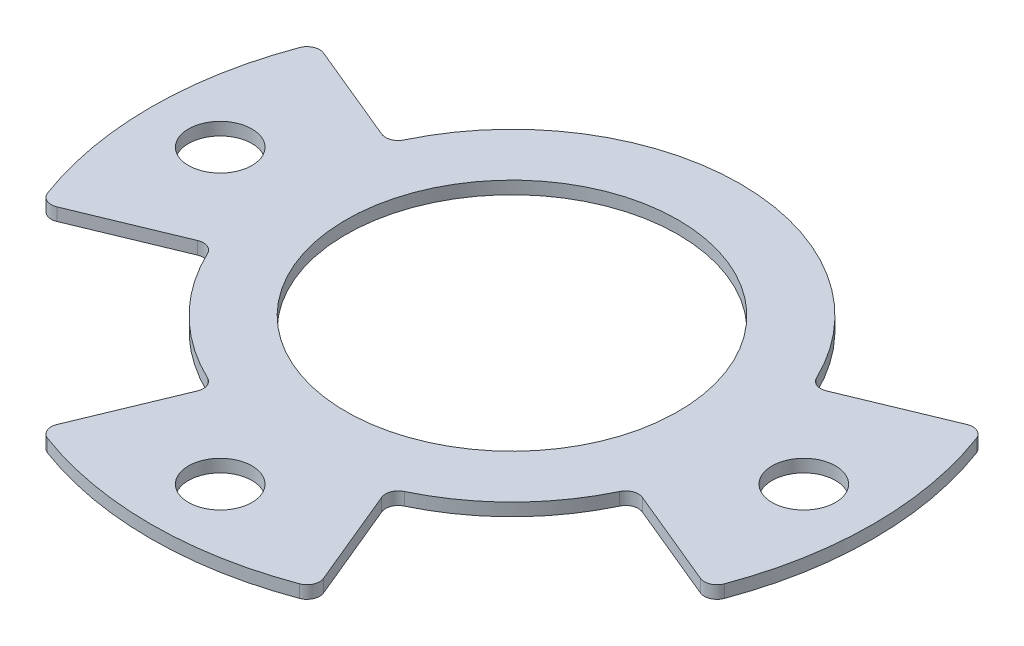
ISO-10303-21;
HEADER;
FILE_DESCRIPTION(('STEP AP214'),'2;1');
FILE_NAME('part.step','',(''),(''),'','','');
FILE_SCHEMA(('AUTOMOTIVE_DESIGN { 1 0 10303 214 1 1 1 1 }'));
ENDSEC;
DATA;
#1=APPLICATION_CONTEXT('core data for automotive mechanical design processes');
#2=APPLICATION_PROTOCOL_DEFINITION('international standard','automotive_design',2000,#1);
#3=PRODUCT_CONTEXT('',#1,'mechanical');
#4=PRODUCT('Part','Part','',(#3));
#5=PRODUCT_RELATED_PRODUCT_CATEGORY('part','',(#4));
#6=PRODUCT_DEFINITION_FORMATION('','',#4);
#7=PRODUCT_DEFINITION_CONTEXT('part definition',#1,'design');
#8=PRODUCT_DEFINITION('design','',#6,#7);
#9=PRODUCT_DEFINITION_SHAPE('','',#8);
#10=(LENGTH_UNIT() NAMED_UNIT(*) SI_UNIT(.MILLI.,.METRE.));
#11=(NAMED_UNIT(*) PLANE_ANGLE_UNIT() SI_UNIT($,.RADIAN.));
#12=(NAMED_UNIT(*) SI_UNIT($,.STERADIAN.) SOLID_ANGLE_UNIT());
#13=UNCERTAINTY_MEASURE_WITH_UNIT(LENGTH_MEASURE(1.E-05),#10,'distance_accuracy_value','');
#14=(GEOMETRIC_REPRESENTATION_CONTEXT(3) GLOBAL_UNCERTAINTY_ASSIGNED_CONTEXT((#13)) GLOBAL_UNIT_ASSIGNED_CONTEXT((#10,
#11,#12)) REPRESENTATION_CONTEXT('',''));
#15=CARTESIAN_POINT('',(0.,0.,0.));
#16=DIRECTION('',(0.,0.,1.));
#17=DIRECTION('',(1.,0.,0.));
#18=AXIS2_PLACEMENT_3D('',#15,#16,#17);
#19=CARTESIAN_POINT('',(0.,2.54,0.));
#20=DIRECTION('',(0.,-1.,0.));
#21=DIRECTION('',(0.,0.,-1.));
#22=AXIS2_PLACEMENT_3D('',#19,#20,#21);
#23=CYLINDRICAL_SURFACE('',#22,72.3);
#24=CARTESIAN_POINT('',(0.,0.,0.));
#25=DIRECTION('',(0.,1.,0.));
#26=DIRECTION('',(0.,0.,1.));
#27=AXIS2_PLACEMENT_3D('',#24,#25,#26);
#28=CIRCLE('',#27,72.3);
#29=CARTESIAN_POINT('',(-25.2175689687756,0.,67.7596060740102));
#30=VERTEX_POINT('',#29);
#31=CARTESIAN_POINT('',(25.2175689687756,0.,67.7596060740102));
#32=VERTEX_POINT('',#31);
#33=EDGE_CURVE('E223',#30,#32,#28,.T.);
#34=ORIENTED_EDGE('',*,*,#33,.T.);
#35=DIRECTION('',(0.,-1.,0.));
#36=VECTOR('',#35,1.);
#37=CARTESIAN_POINT('',(25.2175689687756,2.54,67.7596060740103));
#38=LINE('',#37,#36);
#39=CARTESIAN_POINT('',(25.2175689687756,2.54,67.7596060740102));
#40=VERTEX_POINT('',#39);
#41=EDGE_CURVE('E311',#32,#40,#38,.F.);
#42=ORIENTED_EDGE('',*,*,#41,.T.);
#43=CARTESIAN_POINT('',(0.,2.54,0.));
#44=DIRECTION('',(0.,1.,0.));
#45=DIRECTION('',(0.,0.,1.));
#46=AXIS2_PLACEMENT_3D('',#43,#44,#45);
#47=CIRCLE('',#46,72.3);
#48=CARTESIAN_POINT('',(-25.2175689687756,2.54,67.7596060740102));
#49=VERTEX_POINT('',#48);
#50=EDGE_CURVE('E227',#49,#40,#47,.T.);
#51=ORIENTED_EDGE('',*,*,#50,.F.);
#52=DIRECTION('',(0.,-1.,0.));
#53=VECTOR('',#52,1.);
#54=CARTESIAN_POINT('',(-25.2175689687756,2.54,67.7596060740103));
#55=LINE('',#54,#53);
#56=EDGE_CURVE('E308',#49,#30,#55,.T.);
#57=ORIENTED_EDGE('',*,*,#56,.T.);
#58=EDGE_LOOP('',(#34,#42,#51,#57));
#59=FACE_BOUND('',#58,.T.);
#60=ADVANCED_FACE('F31',(#59),#23,.T.);
#61=CARTESIAN_POINT('',(-67.7596060740103,2.54,-25.2175689687756));
#62=VERTEX_POINT('',#61);
#63=CARTESIAN_POINT('',(-67.7596060740102,2.54,25.2175689687759));
#64=VERTEX_POINT('',#63);
#65=EDGE_CURVE('E215',#62,#64,#47,.T.);
#66=ORIENTED_EDGE('',*,*,#65,.F.);
#67=DIRECTION('',(0.,-1.,0.));
#68=VECTOR('',#67,1.);
#69=CARTESIAN_POINT('',(-67.7596060740103,2.54,-25.2175689687756));
#70=LINE('',#69,#68);
#71=CARTESIAN_POINT('',(-67.7596060740103,0.,-25.2175689687756));
#72=VERTEX_POINT('',#71);
#73=EDGE_CURVE('E198',#62,#72,#70,.T.);
#74=ORIENTED_EDGE('',*,*,#73,.T.);
#75=CARTESIAN_POINT('',(-67.7596060740102,0.,25.2175689687759));
#76=VERTEX_POINT('',#75);
#77=EDGE_CURVE('E212',#72,#76,#28,.T.);
#78=ORIENTED_EDGE('',*,*,#77,.T.);
#79=DIRECTION('',(0.,-1.,0.));
#80=VECTOR('',#79,1.);
#81=CARTESIAN_POINT('',(-67.7596060740102,2.54,25.2175689687759));
#82=LINE('',#81,#80);
#83=EDGE_CURVE('E217',#76,#64,#82,.F.);
#84=ORIENTED_EDGE('',*,*,#83,.T.);
#85=EDGE_LOOP('',(#66,#74,#78,#84));
#86=FACE_BOUND('',#85,.T.);
#87=ADVANCED_FACE('F210',(#86),#23,.T.);
#88=CARTESIAN_POINT('',(67.7596060740102,0.,25.2175689687759));
#89=VERTEX_POINT('',#88);
#90=CARTESIAN_POINT('',(67.7596060740102,0.,-25.2175689687756));
#91=VERTEX_POINT('',#90);
#92=EDGE_CURVE('E225',#89,#91,#28,.T.);
#93=ORIENTED_EDGE('',*,*,#92,.T.);
#94=DIRECTION('',(0.,-1.,0.));
#95=VECTOR('',#94,1.);
#96=CARTESIAN_POINT('',(67.7596060740102,2.54,-25.2175689687756));
#97=LINE('',#96,#95);
#98=CARTESIAN_POINT('',(67.7596060740102,2.54,-25.2175689687756));
#99=VERTEX_POINT('',#98);
#100=EDGE_CURVE('E292',#91,#99,#97,.F.);
#101=ORIENTED_EDGE('',*,*,#100,.T.);
#102=CARTESIAN_POINT('',(67.7596060740102,2.54,25.2175689687759));
#103=VERTEX_POINT('',#102);
#104=EDGE_CURVE('E222',#103,#99,#47,.T.);
#105=ORIENTED_EDGE('',*,*,#104,.F.);
#106=DIRECTION('',(0.,-1.,0.));
#107=VECTOR('',#106,1.);
#108=CARTESIAN_POINT('',(67.7596060740102,2.54,25.2175689687759));
#109=LINE('',#108,#107);
#110=EDGE_CURVE('E290',#103,#89,#109,.T.);
#111=ORIENTED_EDGE('',*,*,#110,.T.);
#112=EDGE_LOOP('',(#93,#101,#105,#111));
#113=FACE_BOUND('',#112,.T.);
#114=ADVANCED_FACE('F436',(#113),#23,.T.);
#115=CARTESIAN_POINT('',(0.,2.54,0.));
#116=DIRECTION('',(0.,1.,0.));
#117=DIRECTION('',(0.,0.,1.));
#118=AXIS2_PLACEMENT_3D('',#115,#116,#117);
#119=PLANE('',#118);
#120=DIRECTION('',(-0.923879532511287,0.,-0.38268343236509));
#121=VECTOR('',#120,1.);
#122=CARTESIAN_POINT('',(-42.239772226416,2.54,-17.4962865277319));
#123=LINE('',#122,#121);
#124=CARTESIAN_POINT('',(-44.524629360732,2.54,-18.4427053408505));
#125=VERTEX_POINT('',#124);
#126=CARTESIAN_POINT('',(-64.4071005371586,2.54,-26.6782945556186));
#127=VERTEX_POINT('',#126);
#128=EDGE_CURVE('E388',#125,#127,#123,.T.);
#129=ORIENTED_EDGE('',*,*,#128,.T.);
#130=CARTESIAN_POINT('',(-65.3791164553659,2.54,-24.3316405430399));
#131=DIRECTION('',(0.,1.,0.));
#132=DIRECTION('',(0.,0.,1.));
#133=AXIS2_PLACEMENT_3D('',#130,#131,#132);
#134=CIRCLE('',#133,2.54);
#135=EDGE_CURVE('E279',#127,#62,#134,.T.);
#136=ORIENTED_EDGE('',*,*,#135,.T.);
#137=ORIENTED_EDGE('',*,*,#65,.T.);
#138=CARTESIAN_POINT('',(-65.3791164553658,2.54,24.3316405430402));
#139=DIRECTION('',(0.,1.,0.));
#140=DIRECTION('',(0.,0.,1.));
#141=AXIS2_PLACEMENT_3D('',#138,#139,#140);
#142=CIRCLE('',#141,2.54);
#143=CARTESIAN_POINT('',(-64.4071005371585,2.54,26.6782945556188));
#144=VERTEX_POINT('',#143);
#145=EDGE_CURVE('E271',#64,#144,#142,.T.);
#146=ORIENTED_EDGE('',*,*,#145,.T.);
#147=DIRECTION('',(0.923879532511285,0.,-0.382683432365094));
#148=VECTOR('',#147,1.);
#149=CARTESIAN_POINT('',(-42.239772226416,2.54,17.4962865277321));
#150=LINE('',#149,#148);
#151=CARTESIAN_POINT('',(-44.524629360732,2.54,18.4427053408507));
#152=VERTEX_POINT('',#151);
#153=EDGE_CURVE('E367',#144,#152,#150,.T.);
#154=ORIENTED_EDGE('',*,*,#153,.T.);
#155=CARTESIAN_POINT('',(-43.5526134425246,2.54,20.7893593534294));
#156=DIRECTION('',(0.,1.,0.));
#157=DIRECTION('',(0.,0.,1.));
#158=AXIS2_PLACEMENT_3D('',#155,#156,#157);
#159=CIRCLE('',#158,2.54);
#160=CARTESIAN_POINT('',(-41.2603706297602,2.54,19.6951825453542));
#161=VERTEX_POINT('',#160);
#162=EDGE_CURVE('E11',#152,#161,#159,.F.);
#163=ORIENTED_EDGE('',*,*,#162,.T.);
#164=CARTESIAN_POINT('',(0.,2.54,0.));
#165=DIRECTION('',(0.,1.,0.));
#166=DIRECTION('',(0.,0.,-1.));
#167=AXIS2_PLACEMENT_3D('',#164,#165,#166);
#168=CIRCLE('',#167,45.72);
#169=CARTESIAN_POINT('',(-19.695182545354,2.54,41.2603706297602));
#170=VERTEX_POINT('',#169);
#171=EDGE_CURVE('E365',#161,#170,#168,.T.);
#172=ORIENTED_EDGE('',*,*,#171,.T.);
#173=CARTESIAN_POINT('',(-20.7893593534292,2.54,43.5526134425247));
#174=DIRECTION('',(0.,1.,0.));
#175=DIRECTION('',(0.,0.,1.));
#176=AXIS2_PLACEMENT_3D('',#173,#174,#175);
#177=CIRCLE('',#176,2.54);
#178=CARTESIAN_POINT('',(-18.4427053408506,2.54,44.524629360732));
#179=VERTEX_POINT('',#178);
#180=EDGE_CURVE('E345',#170,#179,#177,.F.);
#181=ORIENTED_EDGE('',*,*,#180,.T.);
#182=DIRECTION('',(-0.38268343236509,0.,0.923879532511287));
#183=VECTOR('',#182,1.);
#184=CARTESIAN_POINT('',(-35.0924833906736,2.54,84.7207493391165));
#185=LINE('',#184,#183);
#186=CARTESIAN_POINT('',(-26.6782945556186,2.54,64.4071005371586));
#187=VERTEX_POINT('',#186);
#188=EDGE_CURVE('E371',#179,#187,#185,.T.);
#189=ORIENTED_EDGE('',*,*,#188,.T.);
#190=CARTESIAN_POINT('',(-24.3316405430399,2.54,65.3791164553659));
#191=DIRECTION('',(0.,1.,0.));
#192=DIRECTION('',(0.,0.,1.));
#193=AXIS2_PLACEMENT_3D('',#190,#191,#192);
#194=CIRCLE('',#193,2.54);
#195=EDGE_CURVE('E54',#187,#49,#194,.T.);
#196=ORIENTED_EDGE('',*,*,#195,.T.);
#197=ORIENTED_EDGE('',*,*,#50,.T.);
#198=CARTESIAN_POINT('',(24.3316405430399,2.54,65.3791164553659));
#199=DIRECTION('',(0.,1.,0.));
#200=DIRECTION('',(0.,0.,1.));
#201=AXIS2_PLACEMENT_3D('',#198,#199,#200);
#202=CIRCLE('',#201,2.54);
#203=CARTESIAN_POINT('',(26.6782945556186,2.54,64.4071005371586));
#204=VERTEX_POINT('',#203);
#205=EDGE_CURVE('E46',#40,#204,#202,.T.);
#206=ORIENTED_EDGE('',*,*,#205,.T.);
#207=DIRECTION('',(-0.38268343236509,0.,-0.923879532511287));
#208=VECTOR('',#207,1.);
#209=CARTESIAN_POINT('',(35.0924833906736,2.54,84.7207493391165));
#210=LINE('',#209,#208);
#211=CARTESIAN_POINT('',(18.4427053408506,2.54,44.524629360732));
#212=VERTEX_POINT('',#211);
#213=EDGE_CURVE('E383',#204,#212,#210,.T.);
#214=ORIENTED_EDGE('',*,*,#213,.T.);
#215=CARTESIAN_POINT('',(20.7893593534292,2.54,43.5526134425247));
#216=DIRECTION('',(0.,1.,0.));
#217=DIRECTION('',(0.,0.,1.));
#218=AXIS2_PLACEMENT_3D('',#215,#216,#217);
#219=CIRCLE('',#218,2.54);
#220=CARTESIAN_POINT('',(19.695182545354,2.54,41.2603706297602));
#221=VERTEX_POINT('',#220);
#222=EDGE_CURVE('E341',#212,#221,#219,.F.);
#223=ORIENTED_EDGE('',*,*,#222,.T.);
#224=CARTESIAN_POINT('',(0.,2.54,0.));
#225=DIRECTION('',(0.,1.,0.));
#226=DIRECTION('',(0.,0.,1.));
#227=AXIS2_PLACEMENT_3D('',#224,#225,#226);
#228=CIRCLE('',#227,45.72);
#229=CARTESIAN_POINT('',(41.2603706297602,2.54,19.6951825453542));
#230=VERTEX_POINT('',#229);
#231=EDGE_CURVE('E671',#221,#230,#228,.T.);
#232=ORIENTED_EDGE('',*,*,#231,.T.);
#233=CARTESIAN_POINT('',(43.5526134425246,2.54,20.7893593534294));
#234=DIRECTION('',(0.,1.,0.));
#235=DIRECTION('',(0.,0.,1.));
#236=AXIS2_PLACEMENT_3D('',#233,#234,#235);
#237=CIRCLE('',#236,2.54);
#238=CARTESIAN_POINT('',(44.524629360732,2.54,18.4427053408507));
#239=VERTEX_POINT('',#238);
#240=EDGE_CURVE('E337',#230,#239,#237,.F.);
#241=ORIENTED_EDGE('',*,*,#240,.T.);
#242=DIRECTION('',(0.923879532511285,0.,0.382683432365094));
#243=VECTOR('',#242,1.);
#244=CARTESIAN_POINT('',(42.239772226416,2.54,17.4962865277321));
#245=LINE('',#244,#243);
#246=CARTESIAN_POINT('',(64.4071005371585,2.54,26.6782945556188));
#247=VERTEX_POINT('',#246);
#248=EDGE_CURVE('E668',#239,#247,#245,.T.);
#249=ORIENTED_EDGE('',*,*,#248,.T.);
#250=CARTESIAN_POINT('',(65.3791164553658,2.54,24.3316405430402));
#251=DIRECTION('',(0.,1.,0.));
#252=DIRECTION('',(0.,0.,1.));
#253=AXIS2_PLACEMENT_3D('',#250,#251,#252);
#254=CIRCLE('',#253,2.54);
#255=EDGE_CURVE('E275',#247,#103,#254,.T.);
#256=ORIENTED_EDGE('',*,*,#255,.T.);
#257=ORIENTED_EDGE('',*,*,#104,.T.);
#258=CARTESIAN_POINT('',(65.3791164553659,2.54,-24.3316405430399));
#259=DIRECTION('',(0.,1.,0.));
#260=DIRECTION('',(0.,0.,1.));
#261=AXIS2_PLACEMENT_3D('',#258,#259,#260);
#262=CIRCLE('',#261,2.54);
#263=CARTESIAN_POINT('',(64.4071005371586,2.54,-26.6782945556186));
#264=VERTEX_POINT('',#263);
#265=EDGE_CURVE('E277',#99,#264,#262,.T.);
#266=ORIENTED_EDGE('',*,*,#265,.T.);
#267=DIRECTION('',(-0.923879532511286,0.,0.382683432365091));
#268=VECTOR('',#267,1.);
#269=CARTESIAN_POINT('',(196.027114775618,2.54,-81.1970895329286));
#270=LINE('',#269,#268);
#271=CARTESIAN_POINT('',(44.524629360732,2.54,-18.4427053408506));
#272=VERTEX_POINT('',#271);
#273=EDGE_CURVE('E391',#264,#272,#270,.T.);
#274=ORIENTED_EDGE('',*,*,#273,.T.);
#275=CARTESIAN_POINT('',(43.5526134425247,2.54,-20.7893593534292));
#276=DIRECTION('',(0.,1.,0.));
#277=DIRECTION('',(0.,0.,1.));
#278=AXIS2_PLACEMENT_3D('',#275,#276,#277);
#279=CIRCLE('',#278,2.54);
#280=CARTESIAN_POINT('',(41.2603706297602,2.54,-19.695182545354));
#281=VERTEX_POINT('',#280);
#282=EDGE_CURVE('E333',#272,#281,#279,.F.);
#283=ORIENTED_EDGE('',*,*,#282,.T.);
#284=CARTESIAN_POINT('',(0.,2.54,0.));
#285=DIRECTION('',(0.,1.,0.));
#286=DIRECTION('',(0.,0.,-1.));
#287=AXIS2_PLACEMENT_3D('',#284,#285,#286);
#288=CIRCLE('',#287,45.72);
#289=CARTESIAN_POINT('',(-41.2603706297603,2.54,-19.695182545354));
#290=VERTEX_POINT('',#289);
#291=EDGE_CURVE('E385',#281,#290,#288,.T.);
#292=ORIENTED_EDGE('',*,*,#291,.T.);
#293=CARTESIAN_POINT('',(-43.5526134425247,2.54,-20.7893593534292));
#294=DIRECTION('',(0.,1.,0.));
#295=DIRECTION('',(0.,0.,1.));
#296=AXIS2_PLACEMENT_3D('',#293,#294,#295);
#297=CIRCLE('',#296,2.54);
#298=EDGE_CURVE('E329',#290,#125,#297,.F.);
#299=ORIENTED_EDGE('',*,*,#298,.T.);
#300=EDGE_LOOP('',(#129,#136,#137,#146,#154,#163,#172,#181,#189,#196,#197,#206,#214,#223,#232,
#241,#249,#256,#257,#266,#274,#283,#292,#299));
#301=FACE_BOUND('',#300,.T.);
#302=CARTESIAN_POINT('',(0.,2.54,0.));
#303=DIRECTION('',(0.,-1.,0.));
#304=DIRECTION('',(0.,0.,-1.));
#305=AXIS2_PLACEMENT_3D('',#302,#303,#304);
#306=CIRCLE('',#305,33.25);
#307=CARTESIAN_POINT('',(0.,2.54,-33.25));
#308=VERTEX_POINT('',#307);
#309=EDGE_CURVE('E398',#308,#308,#306,.T.);
#310=ORIENTED_EDGE('',*,*,#309,.T.);
#311=EDGE_LOOP('',(#310));
#312=FACE_BOUND('',#311,.T.);
#313=CARTESIAN_POINT('',(0.,2.54,58.42));
#314=DIRECTION('',(0.,-1.,0.));
#315=DIRECTION('',(0.,0.,-1.));
#316=AXIS2_PLACEMENT_3D('',#313,#314,#315);
#317=CIRCLE('',#316,6.35);
#318=CARTESIAN_POINT('',(0.,2.54,52.07));
#319=VERTEX_POINT('',#318);
#320=EDGE_CURVE('E404',#319,#319,#317,.T.);
#321=ORIENTED_EDGE('',*,*,#320,.T.);
#322=EDGE_LOOP('',(#321));
#323=FACE_BOUND('',#322,.T.);
#324=CARTESIAN_POINT('',(58.42,2.54,0.));
#325=DIRECTION('',(0.,-1.,0.));
#326=DIRECTION('',(0.,0.,1.));
#327=AXIS2_PLACEMENT_3D('',#324,#325,#326);
#328=CIRCLE('',#327,6.35);
#329=CARTESIAN_POINT('',(58.42,2.54,6.35));
#330=VERTEX_POINT('',#329);
#331=EDGE_CURVE('E244',#330,#330,#328,.T.);
#332=ORIENTED_EDGE('',*,*,#331,.T.);
#333=EDGE_LOOP('',(#332));
#334=FACE_BOUND('',#333,.T.);
#335=CARTESIAN_POINT('',(-58.42,2.54,0.));
#336=DIRECTION('',(0.,-1.,0.));
#337=DIRECTION('',(0.,0.,-1.));
#338=AXIS2_PLACEMENT_3D('',#335,#336,#337);
#339=CIRCLE('',#338,6.35);
#340=CARTESIAN_POINT('',(-58.42,2.54,-6.35));
#341=VERTEX_POINT('',#340);
#342=EDGE_CURVE('E232',#341,#341,#339,.T.);
#343=ORIENTED_EDGE('',*,*,#342,.T.);
#344=EDGE_LOOP('',(#343));
#345=FACE_BOUND('',#344,.T.);
#346=ADVANCED_FACE('F363',(#301,#312,#323,#334,#345),#119,.T.);
#347=CARTESIAN_POINT('',(0.,0.,0.));
#348=DIRECTION('',(0.,1.,0.));
#349=DIRECTION('',(0.,0.,1.));
#350=AXIS2_PLACEMENT_3D('',#347,#348,#349);
#351=PLANE('',#350);
#352=CARTESIAN_POINT('',(0.,0.,0.));
#353=DIRECTION('',(0.,-1.,0.));
#354=DIRECTION('',(0.,0.,-1.));
#355=AXIS2_PLACEMENT_3D('',#352,#353,#354);
#356=CIRCLE('',#355,33.25);
#357=CARTESIAN_POINT('',(0.,0.,-33.25));
#358=VERTEX_POINT('',#357);
#359=EDGE_CURVE('E394',#358,#358,#356,.T.);
#360=ORIENTED_EDGE('',*,*,#359,.F.);
#361=EDGE_LOOP('',(#360));
#362=FACE_BOUND('',#361,.T.);
#363=CARTESIAN_POINT('',(0.,0.,58.42));
#364=DIRECTION('',(0.,-1.,0.));
#365=DIRECTION('',(0.,0.,-1.));
#366=AXIS2_PLACEMENT_3D('',#363,#364,#365);
#367=CIRCLE('',#366,6.35);
#368=CARTESIAN_POINT('',(0.,0.,52.07));
#369=VERTEX_POINT('',#368);
#370=EDGE_CURVE('E401',#369,#369,#367,.T.);
#371=ORIENTED_EDGE('',*,*,#370,.F.);
#372=EDGE_LOOP('',(#371));
#373=FACE_BOUND('',#372,.T.);
#374=CARTESIAN_POINT('',(58.42,0.,0.));
#375=DIRECTION('',(0.,-1.,0.));
#376=DIRECTION('',(0.,0.,1.));
#377=AXIS2_PLACEMENT_3D('',#374,#375,#376);
#378=CIRCLE('',#377,6.35);
#379=CARTESIAN_POINT('',(58.42,0.,6.35));
#380=VERTEX_POINT('',#379);
#381=EDGE_CURVE('E247',#380,#380,#378,.T.);
#382=ORIENTED_EDGE('',*,*,#381,.F.);
#383=EDGE_LOOP('',(#382));
#384=FACE_BOUND('',#383,.T.);
#385=CARTESIAN_POINT('',(-58.42,0.,0.));
#386=DIRECTION('',(0.,-1.,0.));
#387=DIRECTION('',(0.,0.,-1.));
#388=AXIS2_PLACEMENT_3D('',#385,#386,#387);
#389=CIRCLE('',#388,6.35);
#390=CARTESIAN_POINT('',(-58.42,0.,-6.35));
#391=VERTEX_POINT('',#390);
#392=EDGE_CURVE('E239',#391,#391,#389,.T.);
#393=ORIENTED_EDGE('',*,*,#392,.F.);
#394=EDGE_LOOP('',(#393));
#395=FACE_BOUND('',#394,.T.);
#396=ORIENTED_EDGE('',*,*,#77,.F.);
#397=CARTESIAN_POINT('',(-65.3791164553659,0.,-24.3316405430399));
#398=DIRECTION('',(0.,1.,0.));
#399=DIRECTION('',(0.,0.,1.));
#400=AXIS2_PLACEMENT_3D('',#397,#398,#399);
#401=CIRCLE('',#400,2.54);
#402=CARTESIAN_POINT('',(-64.4071005371586,0.,-26.6782945556186));
#403=VERTEX_POINT('',#402);
#404=EDGE_CURVE('E194',#72,#403,#401,.F.);
#405=ORIENTED_EDGE('',*,*,#404,.T.);
#406=DIRECTION('',(-0.923879532511287,0.,-0.38268343236509));
#407=VECTOR('',#406,1.);
#408=CARTESIAN_POINT('',(-42.239772226416,0.,-17.4962865277319));
#409=LINE('',#408,#407);
#410=CARTESIAN_POINT('',(-44.524629360732,0.,-18.4427053408505));
#411=VERTEX_POINT('',#410);
#412=EDGE_CURVE('E389',#411,#403,#409,.T.);
#413=ORIENTED_EDGE('',*,*,#412,.F.);
#414=CARTESIAN_POINT('',(-43.5526134425247,0.,-20.7893593534292));
#415=DIRECTION('',(0.,1.,0.));
#416=DIRECTION('',(0.,0.,1.));
#417=AXIS2_PLACEMENT_3D('',#414,#415,#416);
#418=CIRCLE('',#417,2.54);
#419=CARTESIAN_POINT('',(-41.2603706297603,0.,-19.695182545354));
#420=VERTEX_POINT('',#419);
#421=EDGE_CURVE('E327',#411,#420,#418,.T.);
#422=ORIENTED_EDGE('',*,*,#421,.T.);
#423=CARTESIAN_POINT('',(0.,0.,0.));
#424=DIRECTION('',(0.,1.,0.));
#425=DIRECTION('',(0.,0.,-1.));
#426=AXIS2_PLACEMENT_3D('',#423,#424,#425);
#427=CIRCLE('',#426,45.72);
#428=CARTESIAN_POINT('',(41.2603706297602,0.,-19.695182545354));
#429=VERTEX_POINT('',#428);
#430=EDGE_CURVE('E382',#429,#420,#427,.T.);
#431=ORIENTED_EDGE('',*,*,#430,.F.);
#432=CARTESIAN_POINT('',(43.5526134425247,0.,-20.7893593534292));
#433=DIRECTION('',(0.,1.,0.));
#434=DIRECTION('',(0.,0.,1.));
#435=AXIS2_PLACEMENT_3D('',#432,#433,#434);
#436=CIRCLE('',#435,2.54);
#437=CARTESIAN_POINT('',(44.5246293607321,0.,-18.4427053408506));
#438=VERTEX_POINT('',#437);
#439=EDGE_CURVE('E331',#429,#438,#436,.T.);
#440=ORIENTED_EDGE('',*,*,#439,.T.);
#441=DIRECTION('',(0.923879532511287,0.,-0.382683432365091));
#442=VECTOR('',#441,1.);
#443=CARTESIAN_POINT('',(0.,0.,0.));
#444=LINE('',#443,#442);
#445=CARTESIAN_POINT('',(64.4071005371586,0.,-26.6782945556186));
#446=VERTEX_POINT('',#445);
#447=EDGE_CURVE('E249',#438,#446,#444,.T.);
#448=ORIENTED_EDGE('',*,*,#447,.T.);
#449=CARTESIAN_POINT('',(65.3791164553659,0.,-24.3316405430399));
#450=DIRECTION('',(0.,1.,0.));
#451=DIRECTION('',(0.,0.,1.));
#452=AXIS2_PLACEMENT_3D('',#449,#450,#451);
#453=CIRCLE('',#452,2.54);
#454=EDGE_CURVE('E205',#446,#91,#453,.F.);
#455=ORIENTED_EDGE('',*,*,#454,.T.);
#456=ORIENTED_EDGE('',*,*,#92,.F.);
#457=CARTESIAN_POINT('',(65.3791164553658,0.,24.3316405430402));
#458=DIRECTION('',(0.,1.,0.));
#459=DIRECTION('',(0.,0.,1.));
#460=AXIS2_PLACEMENT_3D('',#457,#458,#459);
#461=CIRCLE('',#460,2.54);
#462=CARTESIAN_POINT('',(64.4071005371585,0.,26.6782945556188));
#463=VERTEX_POINT('',#462);
#464=EDGE_CURVE('E265',#89,#463,#461,.F.);
#465=ORIENTED_EDGE('',*,*,#464,.T.);
#466=DIRECTION('',(0.923879532511285,0.,0.382683432365094));
#467=VECTOR('',#466,1.);
#468=CARTESIAN_POINT('',(42.239772226416,0.,17.4962865277321));
#469=LINE('',#468,#467);
#470=CARTESIAN_POINT('',(44.524629360732,0.,18.4427053408507));
#471=VERTEX_POINT('',#470);
#472=EDGE_CURVE('E378',#471,#463,#469,.T.);
#473=ORIENTED_EDGE('',*,*,#472,.F.);
#474=CARTESIAN_POINT('',(43.5526134425246,0.,20.7893593534294));
#475=DIRECTION('',(0.,1.,0.));
#476=DIRECTION('',(0.,0.,1.));
#477=AXIS2_PLACEMENT_3D('',#474,#475,#476);
#478=CIRCLE('',#477,2.54);
#479=CARTESIAN_POINT('',(41.2603706297602,0.,19.6951825453542));
#480=VERTEX_POINT('',#479);
#481=EDGE_CURVE('E335',#471,#480,#478,.T.);
#482=ORIENTED_EDGE('',*,*,#481,.T.);
#483=CARTESIAN_POINT('',(0.,0.,0.));
#484=DIRECTION('',(0.,1.,0.));
#485=DIRECTION('',(0.,0.,1.));
#486=AXIS2_PLACEMENT_3D('',#483,#484,#485);
#487=CIRCLE('',#486,45.72);
#488=CARTESIAN_POINT('',(19.695182545354,0.,41.2603706297602));
#489=VERTEX_POINT('',#488);
#490=EDGE_CURVE('E674',#489,#480,#487,.T.);
#491=ORIENTED_EDGE('',*,*,#490,.F.);
#492=CARTESIAN_POINT('',(20.7893593534292,0.,43.5526134425247));
#493=DIRECTION('',(0.,1.,0.));
#494=DIRECTION('',(0.,0.,1.));
#495=AXIS2_PLACEMENT_3D('',#492,#493,#494);
#496=CIRCLE('',#495,2.54);
#497=CARTESIAN_POINT('',(18.4427053408506,0.,44.524629360732));
#498=VERTEX_POINT('',#497);
#499=EDGE_CURVE('E339',#489,#498,#496,.T.);
#500=ORIENTED_EDGE('',*,*,#499,.T.);
#501=DIRECTION('',(0.38268343236509,0.,0.923879532511287));
#502=VECTOR('',#501,1.);
#503=CARTESIAN_POINT('',(0.,0.,0.));
#504=LINE('',#503,#502);
#505=CARTESIAN_POINT('',(26.6782945556186,0.,64.4071005371586));
#506=VERTEX_POINT('',#505);
#507=EDGE_CURVE('E254',#498,#506,#504,.T.);
#508=ORIENTED_EDGE('',*,*,#507,.T.);
#509=CARTESIAN_POINT('',(24.3316405430399,0.,65.3791164553659));
#510=DIRECTION('',(0.,1.,0.));
#511=DIRECTION('',(0.,0.,1.));
#512=AXIS2_PLACEMENT_3D('',#509,#510,#511);
#513=CIRCLE('',#512,2.54);
#514=EDGE_CURVE('E263',#506,#32,#513,.F.);
#515=ORIENTED_EDGE('',*,*,#514,.T.);
#516=ORIENTED_EDGE('',*,*,#33,.F.);
#517=CARTESIAN_POINT('',(-24.3316405430399,0.,65.3791164553659));
#518=DIRECTION('',(0.,1.,0.));
#519=DIRECTION('',(0.,0.,1.));
#520=AXIS2_PLACEMENT_3D('',#517,#518,#519);
#521=CIRCLE('',#520,2.54);
#522=CARTESIAN_POINT('',(-26.6782945556186,0.,64.4071005371586));
#523=VERTEX_POINT('',#522);
#524=EDGE_CURVE('E261',#30,#523,#521,.F.);
#525=ORIENTED_EDGE('',*,*,#524,.T.);
#526=DIRECTION('',(-0.38268343236509,0.,0.923879532511287));
#527=VECTOR('',#526,1.);
#528=CARTESIAN_POINT('',(-35.0924833906736,0.,84.7207493391165));
#529=LINE('',#528,#527);
#530=CARTESIAN_POINT('',(-18.4427053408506,0.,44.524629360732));
#531=VERTEX_POINT('',#530);
#532=EDGE_CURVE('E372',#531,#523,#529,.T.);
#533=ORIENTED_EDGE('',*,*,#532,.F.);
#534=CARTESIAN_POINT('',(-20.7893593534292,0.,43.5526134425247));
#535=DIRECTION('',(0.,1.,0.));
#536=DIRECTION('',(0.,0.,1.));
#537=AXIS2_PLACEMENT_3D('',#534,#535,#536);
#538=CIRCLE('',#537,2.54);
#539=CARTESIAN_POINT('',(-19.695182545354,0.,41.2603706297602));
#540=VERTEX_POINT('',#539);
#541=EDGE_CURVE('E343',#531,#540,#538,.T.);
#542=ORIENTED_EDGE('',*,*,#541,.T.);
#543=CARTESIAN_POINT('',(0.,0.,0.));
#544=DIRECTION('',(0.,1.,0.));
#545=DIRECTION('',(0.,0.,-1.));
#546=AXIS2_PLACEMENT_3D('',#543,#544,#545);
#547=CIRCLE('',#546,45.72);
#548=CARTESIAN_POINT('',(-41.2603706297602,0.,19.6951825453542));
#549=VERTEX_POINT('',#548);
#550=EDGE_CURVE('E349',#549,#540,#547,.T.);
#551=ORIENTED_EDGE('',*,*,#550,.F.);
#552=CARTESIAN_POINT('',(-43.5526134425246,0.,20.7893593534294));
#553=DIRECTION('',(0.,1.,0.));
#554=DIRECTION('',(0.,0.,1.));
#555=AXIS2_PLACEMENT_3D('',#552,#553,#554);
#556=CIRCLE('',#555,2.54);
#557=CARTESIAN_POINT('',(-44.524629360732,0.,18.4427053408507));
#558=VERTEX_POINT('',#557);
#559=EDGE_CURVE('E39',#549,#558,#556,.T.);
#560=ORIENTED_EDGE('',*,*,#559,.T.);
#561=DIRECTION('',(-0.923879532511285,0.,0.382683432365094));
#562=VECTOR('',#561,1.);
#563=CARTESIAN_POINT('',(0.,0.,0.));
#564=LINE('',#563,#562);
#565=CARTESIAN_POINT('',(-64.4071005371585,0.,26.6782945556188));
#566=VERTEX_POINT('',#565);
#567=EDGE_CURVE('E251',#558,#566,#564,.T.);
#568=ORIENTED_EDGE('',*,*,#567,.T.);
#569=CARTESIAN_POINT('',(-65.3791164553658,0.,24.3316405430402));
#570=DIRECTION('',(0.,1.,0.));
#571=DIRECTION('',(0.,0.,1.));
#572=AXIS2_PLACEMENT_3D('',#569,#570,#571);
#573=CIRCLE('',#572,2.54);
#574=EDGE_CURVE('E216',#566,#76,#573,.F.);
#575=ORIENTED_EDGE('',*,*,#574,.T.);
#576=EDGE_LOOP('',(#396,#405,#413,#422,#431,#440,#448,#455,#456,#465,#473,#482,#491,#500,#508,
#515,#516,#525,#533,#542,#551,#560,#568,#575));
#577=FACE_BOUND('',#576,.T.);
#578=ADVANCED_FACE('F219',(#362,#373,#384,#395,#577),#351,.F.);
#579=CARTESIAN_POINT('',(-58.42,2.54,0.));
#580=DIRECTION('',(0.,-1.,0.));
#581=DIRECTION('',(0.,0.,-1.));
#582=AXIS2_PLACEMENT_3D('',#579,#580,#581);
#583=CYLINDRICAL_SURFACE('',#582,6.35);
#584=ORIENTED_EDGE('',*,*,#342,.F.);
#585=EDGE_LOOP('',(#584));
#586=FACE_BOUND('',#585,.T.);
#587=ORIENTED_EDGE('',*,*,#392,.T.);
#588=EDGE_LOOP('',(#587));
#589=FACE_BOUND('',#588,.T.);
#590=ADVANCED_FACE('F418',(#586,#589),#583,.F.);
#591=CARTESIAN_POINT('',(58.42,2.54,0.));
#592=DIRECTION('',(0.,-1.,0.));
#593=DIRECTION('',(0.,0.,-1.));
#594=AXIS2_PLACEMENT_3D('',#591,#592,#593);
#595=CYLINDRICAL_SURFACE('',#594,6.35);
#596=ORIENTED_EDGE('',*,*,#331,.F.);
#597=EDGE_LOOP('',(#596));
#598=FACE_BOUND('',#597,.T.);
#599=ORIENTED_EDGE('',*,*,#381,.T.);
#600=EDGE_LOOP('',(#599));
#601=FACE_BOUND('',#600,.T.);
#602=ADVANCED_FACE('F414',(#598,#601),#595,.F.);
#603=CARTESIAN_POINT('',(0.,2.54,58.42));
#604=DIRECTION('',(0.,-1.,0.));
#605=DIRECTION('',(0.,0.,-1.));
#606=AXIS2_PLACEMENT_3D('',#603,#604,#605);
#607=CYLINDRICAL_SURFACE('',#606,6.35);
#608=ORIENTED_EDGE('',*,*,#320,.F.);
#609=EDGE_LOOP('',(#608));
#610=FACE_BOUND('',#609,.T.);
#611=ORIENTED_EDGE('',*,*,#370,.T.);
#612=EDGE_LOOP('',(#611));
#613=FACE_BOUND('',#612,.T.);
#614=ADVANCED_FACE('F429',(#610,#613),#607,.F.);
#615=CARTESIAN_POINT('',(0.,2.54,0.));
#616=DIRECTION('',(0.,-1.,0.));
#617=DIRECTION('',(0.,0.,-1.));
#618=AXIS2_PLACEMENT_3D('',#615,#616,#617);
#619=CYLINDRICAL_SURFACE('',#618,33.25);
#620=ORIENTED_EDGE('',*,*,#309,.F.);
#621=EDGE_LOOP('',(#620));
#622=FACE_BOUND('',#621,.T.);
#623=ORIENTED_EDGE('',*,*,#359,.T.);
#624=EDGE_LOOP('',(#623));
#625=FACE_BOUND('',#624,.T.);
#626=ADVANCED_FACE('F463',(#622,#625),#619,.F.);
#627=CARTESIAN_POINT('',(196.027114775618,2.54,-81.1970895329286));
#628=DIRECTION('',(0.382683432365091,0.,0.923879532511286));
#629=DIRECTION('',(0.923879532511287,0.,-0.382683432365091));
#630=AXIS2_PLACEMENT_3D('',#627,#628,#629);
#631=PLANE('',#630);
#632=ORIENTED_EDGE('',*,*,#447,.F.);
#633=DIRECTION('',(0.,1.,0.));
#634=VECTOR('',#633,1.);
#635=CARTESIAN_POINT('',(44.524629360732,2.54,-18.4427053408506));
#636=LINE('',#635,#634);
#637=EDGE_CURVE('E288',#438,#272,#636,.T.);
#638=ORIENTED_EDGE('',*,*,#637,.T.);
#639=ORIENTED_EDGE('',*,*,#273,.F.);
#640=DIRECTION('',(0.,-1.,0.));
#641=VECTOR('',#640,1.);
#642=CARTESIAN_POINT('',(64.4071005371585,2.54,-26.6782945556186));
#643=LINE('',#642,#641);
#644=EDGE_CURVE('E286',#264,#446,#643,.T.);
#645=ORIENTED_EDGE('',*,*,#644,.T.);
#646=EDGE_LOOP('',(#632,#638,#639,#645));
#647=FACE_BOUND('',#646,.T.);
#648=ADVANCED_FACE('F457',(#647),#631,.F.);
#649=CARTESIAN_POINT('',(-42.239772226416,2.54,-17.4962865277319));
#650=DIRECTION('',(-0.38268343236509,0.,0.923879532511287));
#651=DIRECTION('',(0.923879532511287,0.,0.38268343236509));
#652=AXIS2_PLACEMENT_3D('',#649,#650,#651);
#653=PLANE('',#652);
#654=ORIENTED_EDGE('',*,*,#412,.T.);
#655=DIRECTION('',(0.,-1.,0.));
#656=VECTOR('',#655,1.);
#657=CARTESIAN_POINT('',(-64.4071005371586,2.54,-26.6782945556186));
#658=LINE('',#657,#656);
#659=EDGE_CURVE('E199',#403,#127,#658,.F.);
#660=ORIENTED_EDGE('',*,*,#659,.T.);
#661=ORIENTED_EDGE('',*,*,#128,.F.);
#662=DIRECTION('',(0.,1.,0.));
#663=VECTOR('',#662,1.);
#664=CARTESIAN_POINT('',(-44.524629360732,0.,-18.4427053408505));
#665=LINE('',#664,#663);
#666=EDGE_CURVE('E204',#125,#411,#665,.F.);
#667=ORIENTED_EDGE('',*,*,#666,.T.);
#668=EDGE_LOOP('',(#654,#660,#661,#667));
#669=FACE_BOUND('',#668,.T.);
#670=ADVANCED_FACE('F462',(#669),#653,.F.);
#671=CARTESIAN_POINT('',(0.,2.54,0.));
#672=DIRECTION('',(0.,-1.,0.));
#673=DIRECTION('',(0.,0.,-1.));
#674=AXIS2_PLACEMENT_3D('',#671,#672,#673);
#675=CYLINDRICAL_SURFACE('',#674,45.72);
#676=ORIENTED_EDGE('',*,*,#430,.T.);
#677=DIRECTION('',(0.,-1.,0.));
#678=VECTOR('',#677,1.);
#679=CARTESIAN_POINT('',(-41.2603706297603,2.54,-19.695182545354));
#680=LINE('',#679,#678);
#681=EDGE_CURVE('E284',#420,#290,#680,.F.);
#682=ORIENTED_EDGE('',*,*,#681,.T.);
#683=ORIENTED_EDGE('',*,*,#291,.F.);
#684=DIRECTION('',(0.,-1.,0.));
#685=VECTOR('',#684,1.);
#686=CARTESIAN_POINT('',(41.2603706297602,2.54,-19.695182545354));
#687=LINE('',#686,#685);
#688=EDGE_CURVE('E281',#281,#429,#687,.T.);
#689=ORIENTED_EDGE('',*,*,#688,.T.);
#690=EDGE_LOOP('',(#676,#682,#683,#689));
#691=FACE_BOUND('',#690,.T.);
#692=ADVANCED_FACE('F475',(#691),#675,.T.);
#693=CARTESIAN_POINT('',(-42.239772226416,2.54,17.4962865277321));
#694=DIRECTION('',(-0.382683432365094,0.,-0.923879532511285));
#695=DIRECTION('',(-0.923879532511285,0.,0.382683432365094));
#696=AXIS2_PLACEMENT_3D('',#693,#694,#695);
#697=PLANE('',#696);
#698=ORIENTED_EDGE('',*,*,#567,.F.);
#699=DIRECTION('',(0.,1.,0.));
#700=VECTOR('',#699,1.);
#701=CARTESIAN_POINT('',(-44.524629360732,2.54,18.4427053408507));
#702=LINE('',#701,#700);
#703=EDGE_CURVE('E325',#558,#152,#702,.T.);
#704=ORIENTED_EDGE('',*,*,#703,.T.);
#705=ORIENTED_EDGE('',*,*,#153,.F.);
#706=DIRECTION('',(0.,-1.,0.));
#707=VECTOR('',#706,1.);
#708=CARTESIAN_POINT('',(-64.4071005371585,2.54,26.6782945556188));
#709=LINE('',#708,#707);
#710=EDGE_CURVE('E323',#144,#566,#709,.T.);
#711=ORIENTED_EDGE('',*,*,#710,.T.);
#712=EDGE_LOOP('',(#698,#704,#705,#711));
#713=FACE_BOUND('',#712,.T.);
#714=ADVANCED_FACE('F354',(#713),#697,.F.);
#715=CARTESIAN_POINT('',(-35.0924833906736,2.54,84.7207493391165));
#716=DIRECTION('',(0.923879532511287,0.,0.38268343236509));
#717=DIRECTION('',(0.38268343236509,0.,-0.923879532511287));
#718=AXIS2_PLACEMENT_3D('',#715,#716,#717);
#719=PLANE('',#718);
#720=ORIENTED_EDGE('',*,*,#532,.T.);
#721=DIRECTION('',(0.,-1.,0.));
#722=VECTOR('',#721,1.);
#723=CARTESIAN_POINT('',(-26.6782945556186,2.54,64.4071005371586));
#724=LINE('',#723,#722);
#725=EDGE_CURVE('E316',#523,#187,#724,.F.);
#726=ORIENTED_EDGE('',*,*,#725,.T.);
#727=ORIENTED_EDGE('',*,*,#188,.F.);
#728=DIRECTION('',(0.,1.,0.));
#729=VECTOR('',#728,1.);
#730=CARTESIAN_POINT('',(-18.4427053408506,0.,44.524629360732));
#731=LINE('',#730,#729);
#732=EDGE_CURVE('E313',#179,#531,#731,.F.);
#733=ORIENTED_EDGE('',*,*,#732,.T.);
#734=EDGE_LOOP('',(#720,#726,#727,#733));
#735=FACE_BOUND('',#734,.T.);
#736=ADVANCED_FACE('F494',(#735),#719,.F.);
#737=CARTESIAN_POINT('',(0.,2.54,0.));
#738=DIRECTION('',(0.,-1.,0.));
#739=DIRECTION('',(0.,0.,-1.));
#740=AXIS2_PLACEMENT_3D('',#737,#738,#739);
#741=CYLINDRICAL_SURFACE('',#740,45.72);
#742=ORIENTED_EDGE('',*,*,#550,.T.);
#743=DIRECTION('',(0.,-1.,0.));
#744=VECTOR('',#743,1.);
#745=CARTESIAN_POINT('',(-19.695182545354,2.54,41.2603706297602));
#746=LINE('',#745,#744);
#747=EDGE_CURVE('E321',#540,#170,#746,.F.);
#748=ORIENTED_EDGE('',*,*,#747,.T.);
#749=ORIENTED_EDGE('',*,*,#171,.F.);
#750=DIRECTION('',(0.,-1.,0.));
#751=VECTOR('',#750,1.);
#752=CARTESIAN_POINT('',(-41.2603706297602,2.54,19.6951825453542));
#753=LINE('',#752,#751);
#754=EDGE_CURVE('E318',#161,#549,#753,.T.);
#755=ORIENTED_EDGE('',*,*,#754,.T.);
#756=EDGE_LOOP('',(#742,#748,#749,#755));
#757=FACE_BOUND('',#756,.T.);
#758=ADVANCED_FACE('F369',(#757),#741,.T.);
#759=CARTESIAN_POINT('',(35.0924833906736,2.54,84.7207493391165));
#760=DIRECTION('',(-0.923879532511287,0.,0.38268343236509));
#761=DIRECTION('',(0.38268343236509,0.,0.923879532511287));
#762=AXIS2_PLACEMENT_3D('',#759,#760,#761);
#763=PLANE('',#762);
#764=ORIENTED_EDGE('',*,*,#507,.F.);
#765=DIRECTION('',(0.,1.,0.));
#766=VECTOR('',#765,1.);
#767=CARTESIAN_POINT('',(18.4427053408506,2.54,44.524629360732));
#768=LINE('',#767,#766);
#769=EDGE_CURVE('E306',#498,#212,#768,.T.);
#770=ORIENTED_EDGE('',*,*,#769,.T.);
#771=ORIENTED_EDGE('',*,*,#213,.F.);
#772=DIRECTION('',(0.,-1.,0.));
#773=VECTOR('',#772,1.);
#774=CARTESIAN_POINT('',(26.6782945556186,2.54,64.4071005371586));
#775=LINE('',#774,#773);
#776=EDGE_CURVE('E304',#204,#506,#775,.T.);
#777=ORIENTED_EDGE('',*,*,#776,.T.);
#778=EDGE_LOOP('',(#764,#770,#771,#777));
#779=FACE_BOUND('',#778,.T.);
#780=ADVANCED_FACE('F512',(#779),#763,.F.);
#781=CARTESIAN_POINT('',(42.239772226416,2.54,17.4962865277321));
#782=DIRECTION('',(0.382683432365094,0.,-0.923879532511285));
#783=DIRECTION('',(-0.923879532511285,0.,-0.382683432365094));
#784=AXIS2_PLACEMENT_3D('',#781,#782,#783);
#785=PLANE('',#784);
#786=ORIENTED_EDGE('',*,*,#472,.T.);
#787=DIRECTION('',(0.,-1.,0.));
#788=VECTOR('',#787,1.);
#789=CARTESIAN_POINT('',(64.4071005371585,2.54,26.6782945556188));
#790=LINE('',#789,#788);
#791=EDGE_CURVE('E297',#463,#247,#790,.F.);
#792=ORIENTED_EDGE('',*,*,#791,.T.);
#793=ORIENTED_EDGE('',*,*,#248,.F.);
#794=DIRECTION('',(0.,1.,0.));
#795=VECTOR('',#794,1.);
#796=CARTESIAN_POINT('',(44.524629360732,0.,18.4427053408507));
#797=LINE('',#796,#795);
#798=EDGE_CURVE('E294',#239,#471,#797,.F.);
#799=ORIENTED_EDGE('',*,*,#798,.T.);
#800=EDGE_LOOP('',(#786,#792,#793,#799));
#801=FACE_BOUND('',#800,.T.);
#802=ADVANCED_FACE('F521',(#801),#785,.F.);
#803=CARTESIAN_POINT('',(0.,2.54,0.));
#804=DIRECTION('',(0.,-1.,0.));
#805=DIRECTION('',(0.,0.,-1.));
#806=AXIS2_PLACEMENT_3D('',#803,#804,#805);
#807=CYLINDRICAL_SURFACE('',#806,45.72);
#808=ORIENTED_EDGE('',*,*,#490,.T.);
#809=DIRECTION('',(0.,-1.,0.));
#810=VECTOR('',#809,1.);
#811=CARTESIAN_POINT('',(41.2603706297602,2.54,19.6951825453542));
#812=LINE('',#811,#810);
#813=EDGE_CURVE('E302',#480,#230,#812,.F.);
#814=ORIENTED_EDGE('',*,*,#813,.T.);
#815=ORIENTED_EDGE('',*,*,#231,.F.);
#816=DIRECTION('',(0.,-1.,0.));
#817=VECTOR('',#816,1.);
#818=CARTESIAN_POINT('',(19.695182545354,2.54,41.2603706297602));
#819=LINE('',#818,#817);
#820=EDGE_CURVE('E299',#221,#489,#819,.T.);
#821=ORIENTED_EDGE('',*,*,#820,.T.);
#822=EDGE_LOOP('',(#808,#814,#815,#821));
#823=FACE_BOUND('',#822,.T.);
#824=ADVANCED_FACE('F531',(#823),#807,.T.);
#825=CARTESIAN_POINT('',(-65.3791164553659,2.54,-24.3316405430399));
#826=DIRECTION('',(0.,-1.,0.));
#827=DIRECTION('',(0.,0.,-1.));
#828=AXIS2_PLACEMENT_3D('',#825,#826,#827);
#829=CYLINDRICAL_SURFACE('',#828,2.54);
#830=ORIENTED_EDGE('',*,*,#135,.F.);
#831=ORIENTED_EDGE('',*,*,#659,.F.);
#832=ORIENTED_EDGE('',*,*,#404,.F.);
#833=ORIENTED_EDGE('',*,*,#73,.F.);
#834=EDGE_LOOP('',(#830,#831,#832,#833));
#835=FACE_BOUND('',#834,.T.);
#836=ADVANCED_FACE('F197',(#835),#829,.T.);
#837=CARTESIAN_POINT('',(-43.5526134425247,2.54,-20.7893593534292));
#838=DIRECTION('',(0.,-1.,0.));
#839=DIRECTION('',(0.,0.,-1.));
#840=AXIS2_PLACEMENT_3D('',#837,#838,#839);
#841=CYLINDRICAL_SURFACE('',#840,2.54);
#842=ORIENTED_EDGE('',*,*,#298,.F.);
#843=ORIENTED_EDGE('',*,*,#681,.F.);
#844=ORIENTED_EDGE('',*,*,#421,.F.);
#845=ORIENTED_EDGE('',*,*,#666,.F.);
#846=EDGE_LOOP('',(#842,#843,#844,#845));
#847=FACE_BOUND('',#846,.T.);
#848=ADVANCED_FACE('F550',(#847),#841,.F.);
#849=CARTESIAN_POINT('',(43.5526134425247,2.54,-20.7893593534292));
#850=DIRECTION('',(0.,-1.,0.));
#851=DIRECTION('',(0.,0.,-1.));
#852=AXIS2_PLACEMENT_3D('',#849,#850,#851);
#853=CYLINDRICAL_SURFACE('',#852,2.54);
#854=ORIENTED_EDGE('',*,*,#282,.F.);
#855=ORIENTED_EDGE('',*,*,#637,.F.);
#856=ORIENTED_EDGE('',*,*,#439,.F.);
#857=ORIENTED_EDGE('',*,*,#688,.F.);
#858=EDGE_LOOP('',(#854,#855,#856,#857));
#859=FACE_BOUND('',#858,.T.);
#860=ADVANCED_FACE('F558',(#859),#853,.F.);
#861=CARTESIAN_POINT('',(65.3791164553659,2.54,-24.3316405430399));
#862=DIRECTION('',(0.,-1.,0.));
#863=DIRECTION('',(0.,0.,-1.));
#864=AXIS2_PLACEMENT_3D('',#861,#862,#863);
#865=CYLINDRICAL_SURFACE('',#864,2.54);
#866=ORIENTED_EDGE('',*,*,#454,.F.);
#867=ORIENTED_EDGE('',*,*,#644,.F.);
#868=ORIENTED_EDGE('',*,*,#265,.F.);
#869=ORIENTED_EDGE('',*,*,#100,.F.);
#870=EDGE_LOOP('',(#866,#867,#868,#869));
#871=FACE_BOUND('',#870,.T.);
#872=ADVANCED_FACE('F568',(#871),#865,.T.);
#873=CARTESIAN_POINT('',(65.3791164553658,2.54,24.3316405430402));
#874=DIRECTION('',(0.,-1.,0.));
#875=DIRECTION('',(0.,0.,-1.));
#876=AXIS2_PLACEMENT_3D('',#873,#874,#875);
#877=CYLINDRICAL_SURFACE('',#876,2.54);
#878=ORIENTED_EDGE('',*,*,#255,.F.);
#879=ORIENTED_EDGE('',*,*,#791,.F.);
#880=ORIENTED_EDGE('',*,*,#464,.F.);
#881=ORIENTED_EDGE('',*,*,#110,.F.);
#882=EDGE_LOOP('',(#878,#879,#880,#881));
#883=FACE_BOUND('',#882,.T.);
#884=ADVANCED_FACE('F578',(#883),#877,.T.);
#885=CARTESIAN_POINT('',(43.5526134425246,2.54,20.7893593534294));
#886=DIRECTION('',(0.,-1.,0.));
#887=DIRECTION('',(0.,0.,-1.));
#888=AXIS2_PLACEMENT_3D('',#885,#886,#887);
#889=CYLINDRICAL_SURFACE('',#888,2.54);
#890=ORIENTED_EDGE('',*,*,#240,.F.);
#891=ORIENTED_EDGE('',*,*,#813,.F.);
#892=ORIENTED_EDGE('',*,*,#481,.F.);
#893=ORIENTED_EDGE('',*,*,#798,.F.);
#894=EDGE_LOOP('',(#890,#891,#892,#893));
#895=FACE_BOUND('',#894,.T.);
#896=ADVANCED_FACE('F588',(#895),#889,.F.);
#897=CARTESIAN_POINT('',(20.7893593534292,2.54,43.5526134425247));
#898=DIRECTION('',(0.,-1.,0.));
#899=DIRECTION('',(0.,0.,-1.));
#900=AXIS2_PLACEMENT_3D('',#897,#898,#899);
#901=CYLINDRICAL_SURFACE('',#900,2.54);
#902=ORIENTED_EDGE('',*,*,#222,.F.);
#903=ORIENTED_EDGE('',*,*,#769,.F.);
#904=ORIENTED_EDGE('',*,*,#499,.F.);
#905=ORIENTED_EDGE('',*,*,#820,.F.);
#906=EDGE_LOOP('',(#902,#903,#904,#905));
#907=FACE_BOUND('',#906,.T.);
#908=ADVANCED_FACE('F598',(#907),#901,.F.);
#909=CARTESIAN_POINT('',(24.3316405430399,2.54,65.3791164553659));
#910=DIRECTION('',(0.,-1.,0.));
#911=DIRECTION('',(0.,0.,-1.));
#912=AXIS2_PLACEMENT_3D('',#909,#910,#911);
#913=CYLINDRICAL_SURFACE('',#912,2.54);
#914=ORIENTED_EDGE('',*,*,#514,.F.);
#915=ORIENTED_EDGE('',*,*,#776,.F.);
#916=ORIENTED_EDGE('',*,*,#205,.F.);
#917=ORIENTED_EDGE('',*,*,#41,.F.);
#918=EDGE_LOOP('',(#914,#915,#916,#917));
#919=FACE_BOUND('',#918,.T.);
#920=ADVANCED_FACE('F608',(#919),#913,.T.);
#921=CARTESIAN_POINT('',(-24.3316405430399,2.54,65.3791164553659));
#922=DIRECTION('',(0.,-1.,0.));
#923=DIRECTION('',(0.,0.,-1.));
#924=AXIS2_PLACEMENT_3D('',#921,#922,#923);
#925=CYLINDRICAL_SURFACE('',#924,2.54);
#926=ORIENTED_EDGE('',*,*,#195,.F.);
#927=ORIENTED_EDGE('',*,*,#725,.F.);
#928=ORIENTED_EDGE('',*,*,#524,.F.);
#929=ORIENTED_EDGE('',*,*,#56,.F.);
#930=EDGE_LOOP('',(#926,#927,#928,#929));
#931=FACE_BOUND('',#930,.T.);
#932=ADVANCED_FACE('F618',(#931),#925,.T.);
#933=CARTESIAN_POINT('',(-20.7893593534292,2.54,43.5526134425247));
#934=DIRECTION('',(0.,-1.,0.));
#935=DIRECTION('',(0.,0.,-1.));
#936=AXIS2_PLACEMENT_3D('',#933,#934,#935);
#937=CYLINDRICAL_SURFACE('',#936,2.54);
#938=ORIENTED_EDGE('',*,*,#180,.F.);
#939=ORIENTED_EDGE('',*,*,#747,.F.);
#940=ORIENTED_EDGE('',*,*,#541,.F.);
#941=ORIENTED_EDGE('',*,*,#732,.F.);
#942=EDGE_LOOP('',(#938,#939,#940,#941));
#943=FACE_BOUND('',#942,.T.);
#944=ADVANCED_FACE('F627',(#943),#937,.F.);
#945=CARTESIAN_POINT('',(-43.5526134425246,2.54,20.7893593534294));
#946=DIRECTION('',(0.,-1.,0.));
#947=DIRECTION('',(0.,0.,-1.));
#948=AXIS2_PLACEMENT_3D('',#945,#946,#947);
#949=CYLINDRICAL_SURFACE('',#948,2.54);
#950=ORIENTED_EDGE('',*,*,#162,.F.);
#951=ORIENTED_EDGE('',*,*,#703,.F.);
#952=ORIENTED_EDGE('',*,*,#559,.F.);
#953=ORIENTED_EDGE('',*,*,#754,.F.);
#954=EDGE_LOOP('',(#950,#951,#952,#953));
#955=FACE_BOUND('',#954,.T.);
#956=ADVANCED_FACE('F359',(#955),#949,.F.);
#957=CARTESIAN_POINT('',(-65.3791164553658,2.54,24.3316405430402));
#958=DIRECTION('',(0.,-1.,0.));
#959=DIRECTION('',(0.,0.,-1.));
#960=AXIS2_PLACEMENT_3D('',#957,#958,#959);
#961=CYLINDRICAL_SURFACE('',#960,2.54);
#962=ORIENTED_EDGE('',*,*,#574,.F.);
#963=ORIENTED_EDGE('',*,*,#710,.F.);
#964=ORIENTED_EDGE('',*,*,#145,.F.);
#965=ORIENTED_EDGE('',*,*,#83,.F.);
#966=EDGE_LOOP('',(#962,#963,#964,#965));
#967=FACE_BOUND('',#966,.T.);
#968=ADVANCED_FACE('F33',(#967),#961,.T.);
#969=CLOSED_SHELL('',(#60,#87,#114,#346,#578,#590,#602,#614,#626,#648,#670,#692,#714,#736,#758,
#780,#802,#824,#836,#848,#860,#872,#884,#896,#908,#920,#932,#944,#956,#968));
#970=MANIFOLD_SOLID_BREP('B2',#969);
#971=ADVANCED_BREP_SHAPE_REPRESENTATION('',(#18,#970),#14);
#972=SHAPE_DEFINITION_REPRESENTATION(#9,#971);
ENDSEC;
END-ISO-10303-21;
